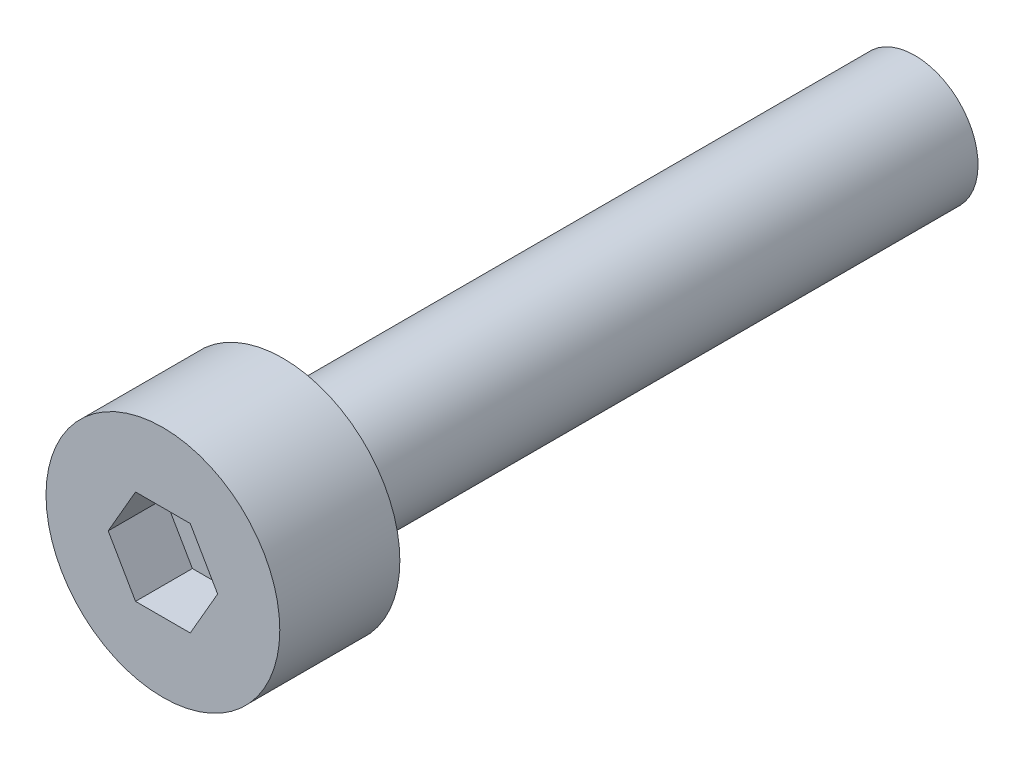
ISO-10303-21;
HEADER;
FILE_DESCRIPTION(('STEP AP214'),'2;1');
FILE_NAME('part.step','',(''),(''),'','','');
FILE_SCHEMA(('AUTOMOTIVE_DESIGN { 1 0 10303 214 1 1 1 1 }'));
ENDSEC;
DATA;
#1=APPLICATION_CONTEXT('core data for automotive mechanical design processes');
#2=APPLICATION_PROTOCOL_DEFINITION('international standard','automotive_design',2000,#1);
#3=PRODUCT_CONTEXT('',#1,'mechanical');
#4=PRODUCT('Part','Part','',(#3));
#5=PRODUCT_RELATED_PRODUCT_CATEGORY('part','',(#4));
#6=PRODUCT_DEFINITION_FORMATION('','',#4);
#7=PRODUCT_DEFINITION_CONTEXT('part definition',#1,'design');
#8=PRODUCT_DEFINITION('design','',#6,#7);
#9=PRODUCT_DEFINITION_SHAPE('','',#8);
#10=(LENGTH_UNIT() NAMED_UNIT(*) SI_UNIT(.MILLI.,.METRE.));
#11=(NAMED_UNIT(*) PLANE_ANGLE_UNIT() SI_UNIT($,.RADIAN.));
#12=(NAMED_UNIT(*) SI_UNIT($,.STERADIAN.) SOLID_ANGLE_UNIT());
#13=UNCERTAINTY_MEASURE_WITH_UNIT(LENGTH_MEASURE(1.E-05),#10,'distance_accuracy_value','');
#14=(GEOMETRIC_REPRESENTATION_CONTEXT(3) GLOBAL_UNCERTAINTY_ASSIGNED_CONTEXT((#13)) GLOBAL_UNIT_ASSIGNED_CONTEXT((#10,
#11,#12)) REPRESENTATION_CONTEXT('',''));
#15=CARTESIAN_POINT('',(0.,0.,0.));
#16=DIRECTION('',(0.,0.,1.));
#17=DIRECTION('',(1.,0.,0.));
#18=AXIS2_PLACEMENT_3D('',#15,#16,#17);
#19=CARTESIAN_POINT('',(0.,0.,0.));
#20=DIRECTION('',(0.,0.,1.));
#21=DIRECTION('',(0.,-1.,0.));
#22=AXIS2_PLACEMENT_3D('',#19,#20,#21);
#23=PLANE('',#22);
#24=DIRECTION('',(-0.5,0.866025403784438,0.));
#25=VECTOR('',#24,1.);
#26=CARTESIAN_POINT('',(0.866025403784439,0.,0.));
#27=LINE('',#26,#25);
#28=CARTESIAN_POINT('',(0.866025403784439,0.,0.));
#29=VERTEX_POINT('',#28);
#30=CARTESIAN_POINT('',(0.433012701892219,0.75,0.));
#31=VERTEX_POINT('',#30);
#32=EDGE_CURVE('E54',#29,#31,#27,.T.);
#33=ORIENTED_EDGE('',*,*,#32,.F.);
#34=DIRECTION('',(0.5,0.866025403784438,0.));
#35=VECTOR('',#34,1.);
#36=CARTESIAN_POINT('',(0.433012701892219,-0.75,0.));
#37=LINE('',#36,#35);
#38=CARTESIAN_POINT('',(0.433012701892219,-0.75,0.));
#39=VERTEX_POINT('',#38);
#40=EDGE_CURVE('E137',#39,#29,#37,.T.);
#41=ORIENTED_EDGE('',*,*,#40,.F.);
#42=DIRECTION('',(1.,0.,0.));
#43=VECTOR('',#42,1.);
#44=CARTESIAN_POINT('',(-0.433012701892219,-0.75,0.));
#45=LINE('',#44,#43);
#46=CARTESIAN_POINT('',(-0.433012701892219,-0.75,0.));
#47=VERTEX_POINT('',#46);
#48=EDGE_CURVE('E135',#47,#39,#45,.T.);
#49=ORIENTED_EDGE('',*,*,#48,.F.);
#50=DIRECTION('',(0.5,-0.866025403784439,0.));
#51=VECTOR('',#50,1.);
#52=CARTESIAN_POINT('',(-0.866025403784438,0.,0.));
#53=LINE('',#52,#51);
#54=CARTESIAN_POINT('',(-0.866025403784438,0.,0.));
#55=VERTEX_POINT('',#54);
#56=EDGE_CURVE('E102',#55,#47,#53,.T.);
#57=ORIENTED_EDGE('',*,*,#56,.F.);
#58=DIRECTION('',(-0.5,-0.866025403784439,0.));
#59=VECTOR('',#58,1.);
#60=CARTESIAN_POINT('',(-0.433012701892219,0.75,0.));
#61=LINE('',#60,#59);
#62=CARTESIAN_POINT('',(-0.433012701892219,0.75,0.));
#63=VERTEX_POINT('',#62);
#64=EDGE_CURVE('E131',#63,#55,#61,.T.);
#65=ORIENTED_EDGE('',*,*,#64,.F.);
#66=DIRECTION('',(-1.,0.,0.));
#67=VECTOR('',#66,1.);
#68=CARTESIAN_POINT('',(0.433012701892219,0.75,0.));
#69=LINE('',#68,#67);
#70=EDGE_CURVE('E128',#31,#63,#69,.T.);
#71=ORIENTED_EDGE('',*,*,#70,.F.);
#72=EDGE_LOOP('',(#33,#41,#49,#57,#65,#71));
#73=FACE_BOUND('',#72,.T.);
#74=CARTESIAN_POINT('',(0.,0.,0.));
#75=DIRECTION('',(0.,0.,-1.));
#76=DIRECTION('',(0.,1.,0.));
#77=AXIS2_PLACEMENT_3D('',#74,#75,#76);
#78=CIRCLE('',#77,1.85);
#79=CARTESIAN_POINT('',(0.,1.85,0.));
#80=VERTEX_POINT('',#79);
#81=EDGE_CURVE('E11',#80,#80,#78,.T.);
#82=ORIENTED_EDGE('',*,*,#81,.F.);
#83=EDGE_LOOP('',(#82));
#84=FACE_BOUND('',#83,.T.);
#85=ADVANCED_FACE('F40',(#73,#84),#23,.T.);
#86=CARTESIAN_POINT('',(0.,0.,-11.9));
#87=DIRECTION('',(0.,0.,-1.));
#88=DIRECTION('',(0.,1.,0.));
#89=AXIS2_PLACEMENT_3D('',#86,#87,#88);
#90=CYLINDRICAL_SURFACE('',#89,1.85);
#91=ORIENTED_EDGE('',*,*,#81,.T.);
#92=EDGE_LOOP('',(#91));
#93=FACE_BOUND('',#92,.T.);
#94=CARTESIAN_POINT('',(0.,0.,-1.9));
#95=DIRECTION('',(0.,0.,-1.));
#96=DIRECTION('',(0.,1.,0.));
#97=AXIS2_PLACEMENT_3D('',#94,#95,#96);
#98=CIRCLE('',#97,1.85);
#99=CARTESIAN_POINT('',(0.,1.85,-1.9));
#100=VERTEX_POINT('',#99);
#101=EDGE_CURVE('E47',#100,#100,#98,.T.);
#102=ORIENTED_EDGE('',*,*,#101,.F.);
#103=EDGE_LOOP('',(#102));
#104=FACE_BOUND('',#103,.T.);
#105=ADVANCED_FACE('F157',(#93,#104),#90,.T.);
#106=CARTESIAN_POINT('',(0.,1.85,-1.9));
#107=DIRECTION('',(0.,0.,-1.));
#108=DIRECTION('',(0.,1.,0.));
#109=AXIS2_PLACEMENT_3D('',#106,#107,#108);
#110=PLANE('',#109);
#111=ORIENTED_EDGE('',*,*,#101,.T.);
#112=EDGE_LOOP('',(#111));
#113=FACE_BOUND('',#112,.T.);
#114=CARTESIAN_POINT('',(0.,0.,-1.9));
#115=DIRECTION('',(0.,0.,-1.));
#116=DIRECTION('',(0.,1.,0.));
#117=AXIS2_PLACEMENT_3D('',#114,#115,#116);
#118=CIRCLE('',#117,1.);
#119=CARTESIAN_POINT('',(0.,1.,-1.9));
#120=VERTEX_POINT('',#119);
#121=EDGE_CURVE('E149',#120,#120,#118,.T.);
#122=ORIENTED_EDGE('',*,*,#121,.F.);
#123=EDGE_LOOP('',(#122));
#124=FACE_BOUND('',#123,.T.);
#125=ADVANCED_FACE('F154',(#113,#124),#110,.T.);
#126=CARTESIAN_POINT('',(0.,0.,-11.9));
#127=DIRECTION('',(0.,0.,-1.));
#128=DIRECTION('',(0.,1.,0.));
#129=AXIS2_PLACEMENT_3D('',#126,#127,#128);
#130=CYLINDRICAL_SURFACE('',#129,0.999999999999999);
#131=ORIENTED_EDGE('',*,*,#121,.T.);
#132=EDGE_LOOP('',(#131));
#133=FACE_BOUND('',#132,.T.);
#134=CARTESIAN_POINT('',(0.,0.,-11.9));
#135=DIRECTION('',(0.,0.,-1.));
#136=DIRECTION('',(0.,1.,0.));
#137=AXIS2_PLACEMENT_3D('',#134,#135,#136);
#138=CIRCLE('',#137,0.999999999999998);
#139=CARTESIAN_POINT('',(0.,0.999999999999997,-11.9));
#140=VERTEX_POINT('',#139);
#141=EDGE_CURVE('E141',#140,#140,#138,.T.);
#142=ORIENTED_EDGE('',*,*,#141,.F.);
#143=EDGE_LOOP('',(#142));
#144=FACE_BOUND('',#143,.T.);
#145=ADVANCED_FACE('F164',(#133,#144),#130,.T.);
#146=CARTESIAN_POINT('',(0.,0.999999999999997,-11.9));
#147=DIRECTION('',(0.,0.,-1.));
#148=DIRECTION('',(0.,1.,0.));
#149=AXIS2_PLACEMENT_3D('',#146,#147,#148);
#150=PLANE('',#149);
#151=ORIENTED_EDGE('',*,*,#141,.T.);
#152=EDGE_LOOP('',(#151));
#153=FACE_BOUND('',#152,.T.);
#154=ADVANCED_FACE('F170',(#153),#150,.T.);
#155=CARTESIAN_POINT('',(0.866025403784439,0.,-0.9));
#156=DIRECTION('',(0.866025403784438,0.5,0.));
#157=DIRECTION('',(-0.5,0.866025403784438,0.));
#158=AXIS2_PLACEMENT_3D('',#155,#156,#157);
#159=PLANE('',#158);
#160=ORIENTED_EDGE('',*,*,#32,.T.);
#161=DIRECTION('',(0.,0.,1.));
#162=VECTOR('',#161,1.);
#163=CARTESIAN_POINT('',(0.433012701892219,0.75,-0.9));
#164=LINE('',#163,#162);
#165=CARTESIAN_POINT('',(0.433012701892219,0.75,-0.9));
#166=VERTEX_POINT('',#165);
#167=EDGE_CURVE('E84',#166,#31,#164,.T.);
#168=ORIENTED_EDGE('',*,*,#167,.F.);
#169=DIRECTION('',(-0.5,0.866025403784438,0.));
#170=VECTOR('',#169,1.);
#171=CARTESIAN_POINT('',(0.866025403784439,0.,-0.9));
#172=LINE('',#171,#170);
#173=CARTESIAN_POINT('',(0.866025403784439,0.,-0.9));
#174=VERTEX_POINT('',#173);
#175=EDGE_CURVE('E139',#174,#166,#172,.T.);
#176=ORIENTED_EDGE('',*,*,#175,.F.);
#177=DIRECTION('',(0.,0.,1.));
#178=VECTOR('',#177,1.);
#179=CARTESIAN_POINT('',(0.866025403784439,0.,-0.9));
#180=LINE('',#179,#178);
#181=EDGE_CURVE('E62',#174,#29,#180,.T.);
#182=ORIENTED_EDGE('',*,*,#181,.T.);
#183=EDGE_LOOP('',(#160,#168,#176,#182));
#184=FACE_BOUND('',#183,.T.);
#185=ADVANCED_FACE('F174',(#184),#159,.F.);
#186=CARTESIAN_POINT('',(0.433012701892219,-0.75,-0.9));
#187=DIRECTION('',(0.866025403784438,-0.5,0.));
#188=DIRECTION('',(0.5,0.866025403784439,0.));
#189=AXIS2_PLACEMENT_3D('',#186,#187,#188);
#190=PLANE('',#189);
#191=ORIENTED_EDGE('',*,*,#40,.T.);
#192=ORIENTED_EDGE('',*,*,#181,.F.);
#193=DIRECTION('',(0.5,0.866025403784438,0.));
#194=VECTOR('',#193,1.);
#195=CARTESIAN_POINT('',(0.433012701892219,-0.75,-0.9));
#196=LINE('',#195,#194);
#197=CARTESIAN_POINT('',(0.433012701892219,-0.75,-0.9));
#198=VERTEX_POINT('',#197);
#199=EDGE_CURVE('E114',#198,#174,#196,.T.);
#200=ORIENTED_EDGE('',*,*,#199,.F.);
#201=DIRECTION('',(0.,0.,1.));
#202=VECTOR('',#201,1.);
#203=CARTESIAN_POINT('',(0.433012701892219,-0.75,-0.9));
#204=LINE('',#203,#202);
#205=EDGE_CURVE('E106',#198,#39,#204,.T.);
#206=ORIENTED_EDGE('',*,*,#205,.T.);
#207=EDGE_LOOP('',(#191,#192,#200,#206));
#208=FACE_BOUND('',#207,.T.);
#209=ADVANCED_FACE('F178',(#208),#190,.F.);
#210=CARTESIAN_POINT('',(-0.433012701892219,-0.75,-0.9));
#211=DIRECTION('',(0.,-1.,0.));
#212=DIRECTION('',(1.,0.,0.));
#213=AXIS2_PLACEMENT_3D('',#210,#211,#212);
#214=PLANE('',#213);
#215=ORIENTED_EDGE('',*,*,#48,.T.);
#216=ORIENTED_EDGE('',*,*,#205,.F.);
#217=DIRECTION('',(1.,0.,0.));
#218=VECTOR('',#217,1.);
#219=CARTESIAN_POINT('',(-0.433012701892219,-0.75,-0.9));
#220=LINE('',#219,#218);
#221=CARTESIAN_POINT('',(-0.433012701892219,-0.75,-0.9));
#222=VERTEX_POINT('',#221);
#223=EDGE_CURVE('E110',#222,#198,#220,.T.);
#224=ORIENTED_EDGE('',*,*,#223,.F.);
#225=DIRECTION('',(0.,0.,1.));
#226=VECTOR('',#225,1.);
#227=CARTESIAN_POINT('',(-0.433012701892219,-0.75,-0.9));
#228=LINE('',#227,#226);
#229=EDGE_CURVE('E95',#222,#47,#228,.T.);
#230=ORIENTED_EDGE('',*,*,#229,.T.);
#231=EDGE_LOOP('',(#215,#216,#224,#230));
#232=FACE_BOUND('',#231,.T.);
#233=ADVANCED_FACE('F111',(#232),#214,.F.);
#234=CARTESIAN_POINT('',(-0.866025403784438,0.,-0.9));
#235=DIRECTION('',(-0.866025403784438,-0.5,0.));
#236=DIRECTION('',(0.5,-0.866025403784439,0.));
#237=AXIS2_PLACEMENT_3D('',#234,#235,#236);
#238=PLANE('',#237);
#239=ORIENTED_EDGE('',*,*,#56,.T.);
#240=ORIENTED_EDGE('',*,*,#229,.F.);
#241=DIRECTION('',(0.5,-0.866025403784439,0.));
#242=VECTOR('',#241,1.);
#243=CARTESIAN_POINT('',(-0.866025403784438,0.,-0.9));
#244=LINE('',#243,#242);
#245=CARTESIAN_POINT('',(-0.866025403784438,0.,-0.9));
#246=VERTEX_POINT('',#245);
#247=EDGE_CURVE('E99',#246,#222,#244,.T.);
#248=ORIENTED_EDGE('',*,*,#247,.F.);
#249=DIRECTION('',(0.,0.,1.));
#250=VECTOR('',#249,1.);
#251=CARTESIAN_POINT('',(-0.866025403784438,0.,-0.9));
#252=LINE('',#251,#250);
#253=EDGE_CURVE('E107',#246,#55,#252,.T.);
#254=ORIENTED_EDGE('',*,*,#253,.T.);
#255=EDGE_LOOP('',(#239,#240,#248,#254));
#256=FACE_BOUND('',#255,.T.);
#257=ADVANCED_FACE('F97',(#256),#238,.F.);
#258=CARTESIAN_POINT('',(-0.433012701892219,0.75,-0.9));
#259=DIRECTION('',(-0.866025403784439,0.5,0.));
#260=DIRECTION('',(-0.5,-0.866025403784439,0.));
#261=AXIS2_PLACEMENT_3D('',#258,#259,#260);
#262=PLANE('',#261);
#263=ORIENTED_EDGE('',*,*,#64,.T.);
#264=ORIENTED_EDGE('',*,*,#253,.F.);
#265=DIRECTION('',(-0.5,-0.866025403784439,0.));
#266=VECTOR('',#265,1.);
#267=CARTESIAN_POINT('',(-0.433012701892219,0.75,-0.9));
#268=LINE('',#267,#266);
#269=CARTESIAN_POINT('',(-0.433012701892219,0.75,-0.9));
#270=VERTEX_POINT('',#269);
#271=EDGE_CURVE('E120',#270,#246,#268,.T.);
#272=ORIENTED_EDGE('',*,*,#271,.F.);
#273=DIRECTION('',(0.,0.,1.));
#274=VECTOR('',#273,1.);
#275=CARTESIAN_POINT('',(-0.433012701892219,0.75,-0.9));
#276=LINE('',#275,#274);
#277=EDGE_CURVE('E144',#270,#63,#276,.T.);
#278=ORIENTED_EDGE('',*,*,#277,.T.);
#279=EDGE_LOOP('',(#263,#264,#272,#278));
#280=FACE_BOUND('',#279,.T.);
#281=ADVANCED_FACE('F182',(#280),#262,.F.);
#282=CARTESIAN_POINT('',(0.433012701892219,0.75,-0.9));
#283=DIRECTION('',(0.,1.,0.));
#284=DIRECTION('',(0.,0.,1.));
#285=AXIS2_PLACEMENT_3D('',#282,#283,#284);
#286=PLANE('',#285);
#287=ORIENTED_EDGE('',*,*,#70,.T.);
#288=ORIENTED_EDGE('',*,*,#277,.F.);
#289=DIRECTION('',(-1.,0.,0.));
#290=VECTOR('',#289,1.);
#291=CARTESIAN_POINT('',(0.433012701892219,0.75,-0.9));
#292=LINE('',#291,#290);
#293=EDGE_CURVE('E122',#166,#270,#292,.T.);
#294=ORIENTED_EDGE('',*,*,#293,.F.);
#295=ORIENTED_EDGE('',*,*,#167,.T.);
#296=EDGE_LOOP('',(#287,#288,#294,#295));
#297=FACE_BOUND('',#296,.T.);
#298=ADVANCED_FACE('F179',(#297),#286,.F.);
#299=CARTESIAN_POINT('',(0.,0.,-0.9));
#300=DIRECTION('',(0.,0.,1.));
#301=DIRECTION('',(1.,0.,0.));
#302=AXIS2_PLACEMENT_3D('',#299,#300,#301);
#303=PLANE('',#302);
#304=ORIENTED_EDGE('',*,*,#175,.T.);
#305=ORIENTED_EDGE('',*,*,#293,.T.);
#306=ORIENTED_EDGE('',*,*,#271,.T.);
#307=ORIENTED_EDGE('',*,*,#247,.T.);
#308=ORIENTED_EDGE('',*,*,#223,.T.);
#309=ORIENTED_EDGE('',*,*,#199,.T.);
#310=EDGE_LOOP('',(#304,#305,#306,#307,#308,#309));
#311=FACE_BOUND('',#310,.T.);
#312=ADVANCED_FACE('F117',(#311),#303,.T.);
#313=CLOSED_SHELL('',(#85,#105,#125,#145,#154,#185,#209,#233,#257,#281,#298,#312));
#314=MANIFOLD_SOLID_BREP('B2',#313);
#315=ADVANCED_BREP_SHAPE_REPRESENTATION('',(#18,#314),#14);
#316=SHAPE_DEFINITION_REPRESENTATION(#9,#315);
ENDSEC;
END-ISO-10303-21;
